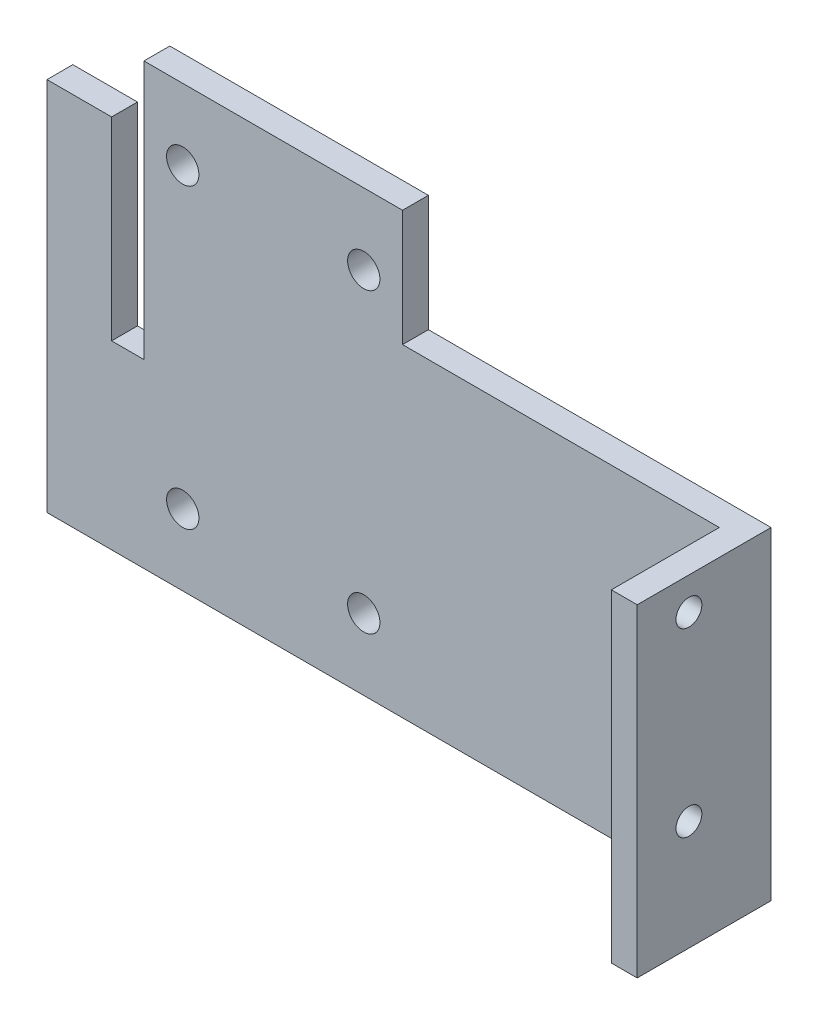
ISO-10303-21;
HEADER;
FILE_DESCRIPTION(('STEP AP214'),'2;1');
FILE_NAME('part.step','',(''),(''),'','','');
FILE_SCHEMA(('AUTOMOTIVE_DESIGN { 1 0 10303 214 1 1 1 1 }'));
ENDSEC;
DATA;
#1=APPLICATION_CONTEXT('core data for automotive mechanical design processes');
#2=APPLICATION_PROTOCOL_DEFINITION('international standard','automotive_design',2000,#1);
#3=PRODUCT_CONTEXT('',#1,'mechanical');
#4=PRODUCT('Part','Part','',(#3));
#5=PRODUCT_RELATED_PRODUCT_CATEGORY('part','',(#4));
#6=PRODUCT_DEFINITION_FORMATION('','',#4);
#7=PRODUCT_DEFINITION_CONTEXT('part definition',#1,'design');
#8=PRODUCT_DEFINITION('design','',#6,#7);
#9=PRODUCT_DEFINITION_SHAPE('','',#8);
#10=(LENGTH_UNIT() NAMED_UNIT(*) SI_UNIT(.MILLI.,.METRE.));
#11=(NAMED_UNIT(*) PLANE_ANGLE_UNIT() SI_UNIT($,.RADIAN.));
#12=(NAMED_UNIT(*) SI_UNIT($,.STERADIAN.) SOLID_ANGLE_UNIT());
#13=UNCERTAINTY_MEASURE_WITH_UNIT(LENGTH_MEASURE(1.E-05),#10,'distance_accuracy_value','');
#14=(GEOMETRIC_REPRESENTATION_CONTEXT(3) GLOBAL_UNCERTAINTY_ASSIGNED_CONTEXT((#13)) GLOBAL_UNIT_ASSIGNED_CONTEXT((#10,
#11,#12)) REPRESENTATION_CONTEXT('',''));
#15=CARTESIAN_POINT('',(0.,0.,0.));
#16=DIRECTION('',(0.,0.,1.));
#17=DIRECTION('',(1.,0.,0.));
#18=AXIS2_PLACEMENT_3D('',#15,#16,#17);
#19=CARTESIAN_POINT('',(0.,0.,4.));
#20=DIRECTION('',(0.,0.,-1.));
#21=DIRECTION('',(-1.,0.,0.));
#22=AXIS2_PLACEMENT_3D('',#19,#20,#21);
#23=PLANE('',#22);
#24=CARTESIAN_POINT('',(93.,25.,4.));
#25=DIRECTION('',(0.,0.,1.));
#26=DIRECTION('',(1.,0.,0.));
#27=AXIS2_PLACEMENT_3D('',#24,#25,#26);
#28=CIRCLE('',#27,2.5);
#29=CARTESIAN_POINT('',(95.5,25.,4.));
#30=VERTEX_POINT('',#29);
#31=EDGE_CURVE('E180',#30,#30,#28,.T.);
#32=ORIENTED_EDGE('',*,*,#31,.F.);
#33=EDGE_LOOP('',(#32));
#34=FACE_BOUND('',#33,.T.);
#35=CARTESIAN_POINT('',(49.,11.,4.));
#36=DIRECTION('',(0.,0.,1.));
#37=DIRECTION('',(1.,0.,0.));
#38=AXIS2_PLACEMENT_3D('',#35,#36,#37);
#39=CIRCLE('',#38,2.5);
#40=CARTESIAN_POINT('',(51.5,11.,4.));
#41=VERTEX_POINT('',#40);
#42=EDGE_CURVE('E188',#41,#41,#39,.T.);
#43=ORIENTED_EDGE('',*,*,#42,.F.);
#44=EDGE_LOOP('',(#43));
#45=FACE_BOUND('',#44,.T.);
#46=CARTESIAN_POINT('',(21.,11.,4.));
#47=DIRECTION('',(0.,0.,1.));
#48=DIRECTION('',(1.,0.,0.));
#49=AXIS2_PLACEMENT_3D('',#46,#47,#48);
#50=CIRCLE('',#49,2.5);
#51=CARTESIAN_POINT('',(23.5,11.,4.));
#52=VERTEX_POINT('',#51);
#53=EDGE_CURVE('E194',#52,#52,#50,.T.);
#54=ORIENTED_EDGE('',*,*,#53,.F.);
#55=EDGE_LOOP('',(#54));
#56=FACE_BOUND('',#55,.T.);
#57=CARTESIAN_POINT('',(49.,57.,4.));
#58=DIRECTION('',(0.,0.,1.));
#59=DIRECTION('',(1.,0.,0.));
#60=AXIS2_PLACEMENT_3D('',#57,#58,#59);
#61=CIRCLE('',#60,2.5);
#62=CARTESIAN_POINT('',(51.5,57.,4.));
#63=VERTEX_POINT('',#62);
#64=EDGE_CURVE('E200',#63,#63,#61,.T.);
#65=ORIENTED_EDGE('',*,*,#64,.F.);
#66=EDGE_LOOP('',(#65));
#67=FACE_BOUND('',#66,.T.);
#68=CARTESIAN_POINT('',(21.,57.,4.));
#69=DIRECTION('',(0.,0.,1.));
#70=DIRECTION('',(1.,0.,0.));
#71=AXIS2_PLACEMENT_3D('',#68,#69,#70);
#72=CIRCLE('',#71,2.5);
#73=CARTESIAN_POINT('',(23.5,57.,4.));
#74=VERTEX_POINT('',#73);
#75=EDGE_CURVE('E204',#74,#74,#72,.T.);
#76=ORIENTED_EDGE('',*,*,#75,.F.);
#77=EDGE_LOOP('',(#76));
#78=FACE_BOUND('',#77,.T.);
#79=DIRECTION('',(-1.,0.,0.));
#80=VECTOR('',#79,1.);
#81=CARTESIAN_POINT('',(0.,68.,4.));
#82=LINE('',#81,#80);
#83=CARTESIAN_POINT('',(55.,68.,4.));
#84=VERTEX_POINT('',#83);
#85=CARTESIAN_POINT('',(15.,68.,4.));
#86=VERTEX_POINT('',#85);
#87=EDGE_CURVE('E285',#84,#86,#82,.T.);
#88=ORIENTED_EDGE('',*,*,#87,.T.);
#89=DIRECTION('',(0.,1.,0.));
#90=VECTOR('',#89,1.);
#91=CARTESIAN_POINT('',(15.,68.,4.));
#92=LINE('',#91,#90);
#93=CARTESIAN_POINT('',(15.,28.,4.));
#94=VERTEX_POINT('',#93);
#95=EDGE_CURVE('E52',#94,#86,#92,.T.);
#96=ORIENTED_EDGE('',*,*,#95,.F.);
#97=DIRECTION('',(1.,0.,0.));
#98=VECTOR('',#97,1.);
#99=CARTESIAN_POINT('',(15.,28.,4.));
#100=LINE('',#99,#98);
#101=CARTESIAN_POINT('',(10.,28.,4.));
#102=VERTEX_POINT('',#101);
#103=EDGE_CURVE('E333',#102,#94,#100,.T.);
#104=ORIENTED_EDGE('',*,*,#103,.F.);
#105=DIRECTION('',(0.,-1.,0.));
#106=VECTOR('',#105,1.);
#107=CARTESIAN_POINT('',(10.,58.,4.));
#108=LINE('',#107,#106);
#109=CARTESIAN_POINT('',(10.,58.,4.));
#110=VERTEX_POINT('',#109);
#111=EDGE_CURVE('E143',#110,#102,#108,.T.);
#112=ORIENTED_EDGE('',*,*,#111,.F.);
#113=DIRECTION('',(1.,0.,0.));
#114=VECTOR('',#113,1.);
#115=CARTESIAN_POINT('',(0.,58.,4.));
#116=LINE('',#115,#114);
#117=CARTESIAN_POINT('',(0.,58.,4.));
#118=VERTEX_POINT('',#117);
#119=EDGE_CURVE('E129',#118,#110,#116,.T.);
#120=ORIENTED_EDGE('',*,*,#119,.F.);
#121=DIRECTION('',(0.,-1.,0.));
#122=VECTOR('',#121,1.);
#123=CARTESIAN_POINT('',(0.,0.,4.));
#124=LINE('',#123,#122);
#125=CARTESIAN_POINT('',(0.,0.,4.));
#126=VERTEX_POINT('',#125);
#127=EDGE_CURVE('E139',#118,#126,#124,.T.);
#128=ORIENTED_EDGE('',*,*,#127,.T.);
#129=DIRECTION('',(1.,0.,0.));
#130=VECTOR('',#129,1.);
#131=CARTESIAN_POINT('',(0.,0.,4.));
#132=LINE('',#131,#130);
#133=CARTESIAN_POINT('',(104.,0.,4.));
#134=VERTEX_POINT('',#133);
#135=EDGE_CURVE('E148',#126,#134,#132,.T.);
#136=ORIENTED_EDGE('',*,*,#135,.T.);
#137=DIRECTION('',(0.,-1.,0.));
#138=VECTOR('',#137,1.);
#139=CARTESIAN_POINT('',(104.,50.,4.));
#140=LINE('',#139,#138);
#141=CARTESIAN_POINT('',(104.,50.,4.));
#142=VERTEX_POINT('',#141);
#143=EDGE_CURVE('E60',#142,#134,#140,.T.);
#144=ORIENTED_EDGE('',*,*,#143,.F.);
#145=DIRECTION('',(-1.,0.,0.));
#146=VECTOR('',#145,1.);
#147=CARTESIAN_POINT('',(55.,50.,4.));
#148=LINE('',#147,#146);
#149=CARTESIAN_POINT('',(55.,50.,4.));
#150=VERTEX_POINT('',#149);
#151=EDGE_CURVE('E151',#142,#150,#148,.T.);
#152=ORIENTED_EDGE('',*,*,#151,.T.);
#153=DIRECTION('',(0.,1.,0.));
#154=VECTOR('',#153,1.);
#155=CARTESIAN_POINT('',(55.,68.,4.));
#156=LINE('',#155,#154);
#157=EDGE_CURVE('E168',#150,#84,#156,.T.);
#158=ORIENTED_EDGE('',*,*,#157,.T.);
#159=EDGE_LOOP('',(#88,#96,#104,#112,#120,#128,#136,#144,#152,#158));
#160=FACE_BOUND('',#159,.T.);
#161=ADVANCED_FACE('F37',(#34,#45,#56,#67,#78,#160),#23,.F.);
#162=CARTESIAN_POINT('',(0.,0.,0.));
#163=DIRECTION('',(0.,0.,-1.));
#164=DIRECTION('',(-1.,0.,0.));
#165=AXIS2_PLACEMENT_3D('',#162,#163,#164);
#166=PLANE('',#165);
#167=DIRECTION('',(0.,-1.,0.));
#168=VECTOR('',#167,1.);
#169=CARTESIAN_POINT('',(15.,0.,0.));
#170=LINE('',#169,#168);
#171=CARTESIAN_POINT('',(15.,68.,0.));
#172=VERTEX_POINT('',#171);
#173=CARTESIAN_POINT('',(15.,28.,0.));
#174=VERTEX_POINT('',#173);
#175=EDGE_CURVE('E324',#172,#174,#170,.T.);
#176=ORIENTED_EDGE('',*,*,#175,.F.);
#177=DIRECTION('',(-1.,0.,0.));
#178=VECTOR('',#177,1.);
#179=CARTESIAN_POINT('',(0.,68.,0.));
#180=LINE('',#179,#178);
#181=CARTESIAN_POINT('',(55.,68.,0.));
#182=VERTEX_POINT('',#181);
#183=EDGE_CURVE('E149',#182,#172,#180,.T.);
#184=ORIENTED_EDGE('',*,*,#183,.F.);
#185=DIRECTION('',(0.,1.,0.));
#186=VECTOR('',#185,1.);
#187=CARTESIAN_POINT('',(55.,68.,0.));
#188=LINE('',#187,#186);
#189=CARTESIAN_POINT('',(55.,50.,0.));
#190=VERTEX_POINT('',#189);
#191=EDGE_CURVE('E154',#190,#182,#188,.T.);
#192=ORIENTED_EDGE('',*,*,#191,.F.);
#193=DIRECTION('',(-1.,0.,0.));
#194=VECTOR('',#193,1.);
#195=CARTESIAN_POINT('',(55.,50.,0.));
#196=LINE('',#195,#194);
#197=CARTESIAN_POINT('',(108.,50.,0.));
#198=VERTEX_POINT('',#197);
#199=EDGE_CURVE('E276',#198,#190,#196,.T.);
#200=ORIENTED_EDGE('',*,*,#199,.F.);
#201=DIRECTION('',(0.,1.,0.));
#202=VECTOR('',#201,1.);
#203=CARTESIAN_POINT('',(108.,0.,0.));
#204=LINE('',#203,#202);
#205=CARTESIAN_POINT('',(108.,0.,0.));
#206=VERTEX_POINT('',#205);
#207=EDGE_CURVE('E265',#206,#198,#204,.T.);
#208=ORIENTED_EDGE('',*,*,#207,.F.);
#209=DIRECTION('',(1.,0.,0.));
#210=VECTOR('',#209,1.);
#211=CARTESIAN_POINT('',(0.,0.,0.));
#212=LINE('',#211,#210);
#213=CARTESIAN_POINT('',(0.,0.,0.));
#214=VERTEX_POINT('',#213);
#215=EDGE_CURVE('E209',#214,#206,#212,.T.);
#216=ORIENTED_EDGE('',*,*,#215,.F.);
#217=DIRECTION('',(0.,-1.,0.));
#218=VECTOR('',#217,1.);
#219=CARTESIAN_POINT('',(0.,0.,0.));
#220=LINE('',#219,#218);
#221=CARTESIAN_POINT('',(0.,58.,0.));
#222=VERTEX_POINT('',#221);
#223=EDGE_CURVE('E206',#222,#214,#220,.T.);
#224=ORIENTED_EDGE('',*,*,#223,.F.);
#225=DIRECTION('',(-1.,0.,0.));
#226=VECTOR('',#225,1.);
#227=CARTESIAN_POINT('',(0.,58.,0.));
#228=LINE('',#227,#226);
#229=CARTESIAN_POINT('',(10.,58.,0.));
#230=VERTEX_POINT('',#229);
#231=EDGE_CURVE('E132',#230,#222,#228,.T.);
#232=ORIENTED_EDGE('',*,*,#231,.F.);
#233=DIRECTION('',(0.,1.,0.));
#234=VECTOR('',#233,1.);
#235=CARTESIAN_POINT('',(10.,0.,0.));
#236=LINE('',#235,#234);
#237=CARTESIAN_POINT('',(10.,28.,0.));
#238=VERTEX_POINT('',#237);
#239=EDGE_CURVE('E45',#238,#230,#236,.T.);
#240=ORIENTED_EDGE('',*,*,#239,.F.);
#241=DIRECTION('',(-1.,0.,0.));
#242=VECTOR('',#241,1.);
#243=CARTESIAN_POINT('',(0.,28.,0.));
#244=LINE('',#243,#242);
#245=EDGE_CURVE('E11',#174,#238,#244,.T.);
#246=ORIENTED_EDGE('',*,*,#245,.F.);
#247=EDGE_LOOP('',(#176,#184,#192,#200,#208,#216,#224,#232,#240,#246));
#248=FACE_BOUND('',#247,.T.);
#249=CARTESIAN_POINT('',(49.,11.,0.));
#250=DIRECTION('',(0.,0.,1.));
#251=DIRECTION('',(1.,0.,0.));
#252=AXIS2_PLACEMENT_3D('',#249,#250,#251);
#253=CIRCLE('',#252,2.5);
#254=CARTESIAN_POINT('',(51.5,11.,0.));
#255=VERTEX_POINT('',#254);
#256=EDGE_CURVE('E183',#255,#255,#253,.T.);
#257=ORIENTED_EDGE('',*,*,#256,.T.);
#258=EDGE_LOOP('',(#257));
#259=FACE_BOUND('',#258,.T.);
#260=CARTESIAN_POINT('',(49.,57.,0.));
#261=DIRECTION('',(0.,0.,1.));
#262=DIRECTION('',(1.,0.,0.));
#263=AXIS2_PLACEMENT_3D('',#260,#261,#262);
#264=CIRCLE('',#263,2.5);
#265=CARTESIAN_POINT('',(51.5,57.,0.));
#266=VERTEX_POINT('',#265);
#267=EDGE_CURVE('E197',#266,#266,#264,.T.);
#268=ORIENTED_EDGE('',*,*,#267,.T.);
#269=EDGE_LOOP('',(#268));
#270=FACE_BOUND('',#269,.T.);
#271=CARTESIAN_POINT('',(21.,57.,0.));
#272=DIRECTION('',(0.,0.,1.));
#273=DIRECTION('',(1.,0.,0.));
#274=AXIS2_PLACEMENT_3D('',#271,#272,#273);
#275=CIRCLE('',#274,2.5);
#276=CARTESIAN_POINT('',(23.5,57.,0.));
#277=VERTEX_POINT('',#276);
#278=EDGE_CURVE('E158',#277,#277,#275,.T.);
#279=ORIENTED_EDGE('',*,*,#278,.T.);
#280=EDGE_LOOP('',(#279));
#281=FACE_BOUND('',#280,.T.);
#282=CARTESIAN_POINT('',(21.,11.,0.));
#283=DIRECTION('',(0.,0.,1.));
#284=DIRECTION('',(1.,0.,0.));
#285=AXIS2_PLACEMENT_3D('',#282,#283,#284);
#286=CIRCLE('',#285,2.5);
#287=CARTESIAN_POINT('',(23.5,11.,0.));
#288=VERTEX_POINT('',#287);
#289=EDGE_CURVE('E191',#288,#288,#286,.T.);
#290=ORIENTED_EDGE('',*,*,#289,.T.);
#291=EDGE_LOOP('',(#290));
#292=FACE_BOUND('',#291,.T.);
#293=CARTESIAN_POINT('',(93.,25.,0.));
#294=DIRECTION('',(0.,0.,1.));
#295=DIRECTION('',(1.,0.,0.));
#296=AXIS2_PLACEMENT_3D('',#293,#294,#295);
#297=CIRCLE('',#296,2.5);
#298=CARTESIAN_POINT('',(95.5,25.,0.));
#299=VERTEX_POINT('',#298);
#300=EDGE_CURVE('E184',#299,#299,#297,.T.);
#301=ORIENTED_EDGE('',*,*,#300,.T.);
#302=EDGE_LOOP('',(#301));
#303=FACE_BOUND('',#302,.T.);
#304=ADVANCED_FACE('F214',(#248,#259,#270,#281,#292,#303),#166,.T.);
#305=CARTESIAN_POINT('',(0.,0.,4.));
#306=DIRECTION('',(1.,0.,0.));
#307=DIRECTION('',(0.,0.,-1.));
#308=AXIS2_PLACEMENT_3D('',#305,#306,#307);
#309=PLANE('',#308);
#310=ORIENTED_EDGE('',*,*,#127,.F.);
#311=DIRECTION('',(0.,0.,1.));
#312=VECTOR('',#311,1.);
#313=CARTESIAN_POINT('',(0.,58.,-6.));
#314=LINE('',#313,#312);
#315=EDGE_CURVE('E125',#222,#118,#314,.T.);
#316=ORIENTED_EDGE('',*,*,#315,.F.);
#317=ORIENTED_EDGE('',*,*,#223,.T.);
#318=DIRECTION('',(0.,0.,-1.));
#319=VECTOR('',#318,1.);
#320=CARTESIAN_POINT('',(0.,0.,4.));
#321=LINE('',#320,#319);
#322=EDGE_CURVE('E147',#126,#214,#321,.T.);
#323=ORIENTED_EDGE('',*,*,#322,.F.);
#324=EDGE_LOOP('',(#310,#316,#317,#323));
#325=FACE_BOUND('',#324,.T.);
#326=ADVANCED_FACE('F39',(#325),#309,.F.);
#327=CARTESIAN_POINT('',(0.,0.,4.));
#328=DIRECTION('',(0.,1.,0.));
#329=DIRECTION('',(0.,0.,1.));
#330=AXIS2_PLACEMENT_3D('',#327,#328,#329);
#331=PLANE('',#330);
#332=ORIENTED_EDGE('',*,*,#215,.T.);
#333=DIRECTION('',(0.,0.,-1.));
#334=VECTOR('',#333,1.);
#335=CARTESIAN_POINT('',(108.,0.,4.));
#336=LINE('',#335,#334);
#337=CARTESIAN_POINT('',(108.,0.,20.7));
#338=VERTEX_POINT('',#337);
#339=EDGE_CURVE('E262',#338,#206,#336,.T.);
#340=ORIENTED_EDGE('',*,*,#339,.F.);
#341=DIRECTION('',(1.,0.,0.));
#342=VECTOR('',#341,1.);
#343=CARTESIAN_POINT('',(108.,0.,20.7));
#344=LINE('',#343,#342);
#345=CARTESIAN_POINT('',(104.,0.,20.7));
#346=VERTEX_POINT('',#345);
#347=EDGE_CURVE('E178',#346,#338,#344,.T.);
#348=ORIENTED_EDGE('',*,*,#347,.F.);
#349=DIRECTION('',(0.,0.,-1.));
#350=VECTOR('',#349,1.);
#351=CARTESIAN_POINT('',(104.,0.,20.7));
#352=LINE('',#351,#350);
#353=EDGE_CURVE('E173',#346,#134,#352,.T.);
#354=ORIENTED_EDGE('',*,*,#353,.T.);
#355=ORIENTED_EDGE('',*,*,#135,.F.);
#356=ORIENTED_EDGE('',*,*,#322,.T.);
#357=EDGE_LOOP('',(#332,#340,#348,#354,#355,#356));
#358=FACE_BOUND('',#357,.T.);
#359=ADVANCED_FACE('F252',(#358),#331,.F.);
#360=CARTESIAN_POINT('',(108.,0.,4.));
#361=DIRECTION('',(-1.,0.,0.));
#362=DIRECTION('',(0.,0.,1.));
#363=AXIS2_PLACEMENT_3D('',#360,#361,#362);
#364=PLANE('',#363);
#365=CARTESIAN_POINT('',(108.,17.,12.7));
#366=DIRECTION('',(1.,0.,0.));
#367=DIRECTION('',(0.,0.,-1.));
#368=AXIS2_PLACEMENT_3D('',#365,#366,#367);
#369=CIRCLE('',#368,2.);
#370=CARTESIAN_POINT('',(108.,17.,10.7));
#371=VERTEX_POINT('',#370);
#372=EDGE_CURVE('E315',#371,#371,#369,.T.);
#373=ORIENTED_EDGE('',*,*,#372,.F.);
#374=EDGE_LOOP('',(#373));
#375=FACE_BOUND('',#374,.T.);
#376=CARTESIAN_POINT('',(108.,45.,12.7));
#377=DIRECTION('',(1.,0.,0.));
#378=DIRECTION('',(0.,0.,-1.));
#379=AXIS2_PLACEMENT_3D('',#376,#377,#378);
#380=CIRCLE('',#379,2.);
#381=CARTESIAN_POINT('',(108.,45.,10.7));
#382=VERTEX_POINT('',#381);
#383=EDGE_CURVE('E300',#382,#382,#380,.T.);
#384=ORIENTED_EDGE('',*,*,#383,.F.);
#385=EDGE_LOOP('',(#384));
#386=FACE_BOUND('',#385,.T.);
#387=ORIENTED_EDGE('',*,*,#207,.T.);
#388=DIRECTION('',(0.,0.,-1.));
#389=VECTOR('',#388,1.);
#390=CARTESIAN_POINT('',(108.,50.,4.));
#391=LINE('',#390,#389);
#392=CARTESIAN_POINT('',(108.,50.,20.7));
#393=VERTEX_POINT('',#392);
#394=EDGE_CURVE('E271',#393,#198,#391,.T.);
#395=ORIENTED_EDGE('',*,*,#394,.F.);
#396=DIRECTION('',(0.,1.,0.));
#397=VECTOR('',#396,1.);
#398=CARTESIAN_POINT('',(108.,50.,20.7));
#399=LINE('',#398,#397);
#400=EDGE_CURVE('E171',#338,#393,#399,.T.);
#401=ORIENTED_EDGE('',*,*,#400,.F.);
#402=ORIENTED_EDGE('',*,*,#339,.T.);
#403=EDGE_LOOP('',(#387,#395,#401,#402));
#404=FACE_BOUND('',#403,.T.);
#405=ADVANCED_FACE('F249',(#375,#386,#404),#364,.F.);
#406=CARTESIAN_POINT('',(55.,50.,4.));
#407=DIRECTION('',(0.,-1.,0.));
#408=DIRECTION('',(0.,0.,-1.));
#409=AXIS2_PLACEMENT_3D('',#406,#407,#408);
#410=PLANE('',#409);
#411=ORIENTED_EDGE('',*,*,#199,.T.);
#412=DIRECTION('',(0.,0.,-1.));
#413=VECTOR('',#412,1.);
#414=CARTESIAN_POINT('',(55.,50.,4.));
#415=LINE('',#414,#413);
#416=EDGE_CURVE('E284',#150,#190,#415,.T.);
#417=ORIENTED_EDGE('',*,*,#416,.F.);
#418=ORIENTED_EDGE('',*,*,#151,.F.);
#419=DIRECTION('',(0.,0.,-1.));
#420=VECTOR('',#419,1.);
#421=CARTESIAN_POINT('',(104.,50.,20.7));
#422=LINE('',#421,#420);
#423=CARTESIAN_POINT('',(104.,50.,20.7));
#424=VERTEX_POINT('',#423);
#425=EDGE_CURVE('E187',#424,#142,#422,.T.);
#426=ORIENTED_EDGE('',*,*,#425,.F.);
#427=DIRECTION('',(-1.,0.,0.));
#428=VECTOR('',#427,1.);
#429=CARTESIAN_POINT('',(108.,50.,20.7));
#430=LINE('',#429,#428);
#431=EDGE_CURVE('E291',#393,#424,#430,.T.);
#432=ORIENTED_EDGE('',*,*,#431,.F.);
#433=ORIENTED_EDGE('',*,*,#394,.T.);
#434=EDGE_LOOP('',(#411,#417,#418,#426,#432,#433));
#435=FACE_BOUND('',#434,.T.);
#436=ADVANCED_FACE('F245',(#435),#410,.F.);
#437=CARTESIAN_POINT('',(55.,68.,4.));
#438=DIRECTION('',(-1.,0.,0.));
#439=DIRECTION('',(0.,-1.,0.));
#440=AXIS2_PLACEMENT_3D('',#437,#438,#439);
#441=PLANE('',#440);
#442=ORIENTED_EDGE('',*,*,#191,.T.);
#443=DIRECTION('',(0.,0.,-1.));
#444=VECTOR('',#443,1.);
#445=CARTESIAN_POINT('',(55.,68.,4.));
#446=LINE('',#445,#444);
#447=EDGE_CURVE('E281',#84,#182,#446,.T.);
#448=ORIENTED_EDGE('',*,*,#447,.F.);
#449=ORIENTED_EDGE('',*,*,#157,.F.);
#450=ORIENTED_EDGE('',*,*,#416,.T.);
#451=EDGE_LOOP('',(#442,#448,#449,#450));
#452=FACE_BOUND('',#451,.T.);
#453=ADVANCED_FACE('F229',(#452),#441,.F.);
#454=CARTESIAN_POINT('',(0.,68.,4.));
#455=DIRECTION('',(0.,-1.,0.));
#456=DIRECTION('',(0.,0.,-1.));
#457=AXIS2_PLACEMENT_3D('',#454,#455,#456);
#458=PLANE('',#457);
#459=ORIENTED_EDGE('',*,*,#183,.T.);
#460=DIRECTION('',(0.,0.,1.));
#461=VECTOR('',#460,1.);
#462=CARTESIAN_POINT('',(15.,68.,4.));
#463=LINE('',#462,#461);
#464=EDGE_CURVE('E316',#172,#86,#463,.T.);
#465=ORIENTED_EDGE('',*,*,#464,.T.);
#466=ORIENTED_EDGE('',*,*,#87,.F.);
#467=ORIENTED_EDGE('',*,*,#447,.T.);
#468=EDGE_LOOP('',(#459,#465,#466,#467));
#469=FACE_BOUND('',#468,.T.);
#470=ADVANCED_FACE('F220',(#469),#458,.F.);
#471=CARTESIAN_POINT('',(21.,57.,4.));
#472=DIRECTION('',(0.,0.,-1.));
#473=DIRECTION('',(-1.,0.,0.));
#474=AXIS2_PLACEMENT_3D('',#471,#472,#473);
#475=CYLINDRICAL_SURFACE('',#474,2.5);
#476=ORIENTED_EDGE('',*,*,#75,.T.);
#477=EDGE_LOOP('',(#476));
#478=FACE_BOUND('',#477,.T.);
#479=ORIENTED_EDGE('',*,*,#278,.F.);
#480=EDGE_LOOP('',(#479));
#481=FACE_BOUND('',#480,.T.);
#482=ADVANCED_FACE('F217',(#478,#481),#475,.F.);
#483=CARTESIAN_POINT('',(49.,57.,4.));
#484=DIRECTION('',(0.,0.,-1.));
#485=DIRECTION('',(-1.,0.,0.));
#486=AXIS2_PLACEMENT_3D('',#483,#484,#485);
#487=CYLINDRICAL_SURFACE('',#486,2.5);
#488=ORIENTED_EDGE('',*,*,#64,.T.);
#489=EDGE_LOOP('',(#488));
#490=FACE_BOUND('',#489,.T.);
#491=ORIENTED_EDGE('',*,*,#267,.F.);
#492=EDGE_LOOP('',(#491));
#493=FACE_BOUND('',#492,.T.);
#494=ADVANCED_FACE('F219',(#490,#493),#487,.F.);
#495=CARTESIAN_POINT('',(21.,11.,4.));
#496=DIRECTION('',(0.,0.,-1.));
#497=DIRECTION('',(-1.,0.,0.));
#498=AXIS2_PLACEMENT_3D('',#495,#496,#497);
#499=CYLINDRICAL_SURFACE('',#498,2.5);
#500=ORIENTED_EDGE('',*,*,#53,.T.);
#501=EDGE_LOOP('',(#500));
#502=FACE_BOUND('',#501,.T.);
#503=ORIENTED_EDGE('',*,*,#289,.F.);
#504=EDGE_LOOP('',(#503));
#505=FACE_BOUND('',#504,.T.);
#506=ADVANCED_FACE('F226',(#502,#505),#499,.F.);
#507=CARTESIAN_POINT('',(49.,11.,4.));
#508=DIRECTION('',(0.,0.,-1.));
#509=DIRECTION('',(-1.,0.,0.));
#510=AXIS2_PLACEMENT_3D('',#507,#508,#509);
#511=CYLINDRICAL_SURFACE('',#510,2.5);
#512=ORIENTED_EDGE('',*,*,#42,.T.);
#513=EDGE_LOOP('',(#512));
#514=FACE_BOUND('',#513,.T.);
#515=ORIENTED_EDGE('',*,*,#256,.F.);
#516=EDGE_LOOP('',(#515));
#517=FACE_BOUND('',#516,.T.);
#518=ADVANCED_FACE('F373',(#514,#517),#511,.F.);
#519=CARTESIAN_POINT('',(93.,25.,4.));
#520=DIRECTION('',(0.,0.,-1.));
#521=DIRECTION('',(-1.,0.,0.));
#522=AXIS2_PLACEMENT_3D('',#519,#520,#521);
#523=CYLINDRICAL_SURFACE('',#522,2.5);
#524=ORIENTED_EDGE('',*,*,#31,.T.);
#525=EDGE_LOOP('',(#524));
#526=FACE_BOUND('',#525,.T.);
#527=ORIENTED_EDGE('',*,*,#300,.F.);
#528=EDGE_LOOP('',(#527));
#529=FACE_BOUND('',#528,.T.);
#530=ADVANCED_FACE('F369',(#526,#529),#523,.F.);
#531=CARTESIAN_POINT('',(104.,50.,20.7));
#532=DIRECTION('',(1.,0.,0.));
#533=DIRECTION('',(0.,0.,-1.));
#534=AXIS2_PLACEMENT_3D('',#531,#532,#533);
#535=PLANE('',#534);
#536=CARTESIAN_POINT('',(104.,17.,12.7));
#537=DIRECTION('',(1.,0.,0.));
#538=DIRECTION('',(0.,0.,-1.));
#539=AXIS2_PLACEMENT_3D('',#536,#537,#538);
#540=CIRCLE('',#539,2.);
#541=CARTESIAN_POINT('',(104.,17.,10.7));
#542=VERTEX_POINT('',#541);
#543=EDGE_CURVE('E312',#542,#542,#540,.T.);
#544=ORIENTED_EDGE('',*,*,#543,.T.);
#545=EDGE_LOOP('',(#544));
#546=FACE_BOUND('',#545,.T.);
#547=CARTESIAN_POINT('',(104.,45.,12.7));
#548=DIRECTION('',(1.,0.,0.));
#549=DIRECTION('',(0.,0.,-1.));
#550=AXIS2_PLACEMENT_3D('',#547,#548,#549);
#551=CIRCLE('',#550,2.);
#552=CARTESIAN_POINT('',(104.,45.,10.7));
#553=VERTEX_POINT('',#552);
#554=EDGE_CURVE('E172',#553,#553,#551,.T.);
#555=ORIENTED_EDGE('',*,*,#554,.T.);
#556=EDGE_LOOP('',(#555));
#557=FACE_BOUND('',#556,.T.);
#558=ORIENTED_EDGE('',*,*,#143,.T.);
#559=ORIENTED_EDGE('',*,*,#353,.F.);
#560=DIRECTION('',(0.,-1.,0.));
#561=VECTOR('',#560,1.);
#562=CARTESIAN_POINT('',(104.,50.,20.7));
#563=LINE('',#562,#561);
#564=EDGE_CURVE('E295',#424,#346,#563,.T.);
#565=ORIENTED_EDGE('',*,*,#564,.F.);
#566=ORIENTED_EDGE('',*,*,#425,.T.);
#567=EDGE_LOOP('',(#558,#559,#565,#566));
#568=FACE_BOUND('',#567,.T.);
#569=ADVANCED_FACE('F366',(#546,#557,#568),#535,.F.);
#570=CARTESIAN_POINT('',(0.,0.,20.7));
#571=DIRECTION('',(0.,0.,-1.));
#572=DIRECTION('',(-1.,0.,0.));
#573=AXIS2_PLACEMENT_3D('',#570,#571,#572);
#574=PLANE('',#573);
#575=ORIENTED_EDGE('',*,*,#400,.T.);
#576=ORIENTED_EDGE('',*,*,#431,.T.);
#577=ORIENTED_EDGE('',*,*,#564,.T.);
#578=ORIENTED_EDGE('',*,*,#347,.T.);
#579=EDGE_LOOP('',(#575,#576,#577,#578));
#580=FACE_BOUND('',#579,.T.);
#581=ADVANCED_FACE('F297',(#580),#574,.F.);
#582=CARTESIAN_POINT('',(98.,45.,12.7));
#583=DIRECTION('',(1.,0.,0.));
#584=DIRECTION('',(0.,0.,-1.));
#585=AXIS2_PLACEMENT_3D('',#582,#583,#584);
#586=CYLINDRICAL_SURFACE('',#585,2.);
#587=ORIENTED_EDGE('',*,*,#383,.T.);
#588=EDGE_LOOP('',(#587));
#589=FACE_BOUND('',#588,.T.);
#590=ORIENTED_EDGE('',*,*,#554,.F.);
#591=EDGE_LOOP('',(#590));
#592=FACE_BOUND('',#591,.T.);
#593=ADVANCED_FACE('F353',(#589,#592),#586,.F.);
#594=CARTESIAN_POINT('',(98.,17.,12.7));
#595=DIRECTION('',(1.,0.,0.));
#596=DIRECTION('',(0.,0.,-1.));
#597=AXIS2_PLACEMENT_3D('',#594,#595,#596);
#598=CYLINDRICAL_SURFACE('',#597,2.);
#599=ORIENTED_EDGE('',*,*,#372,.T.);
#600=EDGE_LOOP('',(#599));
#601=FACE_BOUND('',#600,.T.);
#602=ORIENTED_EDGE('',*,*,#543,.F.);
#603=EDGE_LOOP('',(#602));
#604=FACE_BOUND('',#603,.T.);
#605=ADVANCED_FACE('F346',(#601,#604),#598,.F.);
#606=CARTESIAN_POINT('',(15.,68.,-6.));
#607=DIRECTION('',(1.,0.,0.));
#608=DIRECTION('',(0.,1.,0.));
#609=AXIS2_PLACEMENT_3D('',#606,#607,#608);
#610=PLANE('',#609);
#611=ORIENTED_EDGE('',*,*,#175,.T.);
#612=DIRECTION('',(0.,0.,1.));
#613=VECTOR('',#612,1.);
#614=CARTESIAN_POINT('',(15.,28.,-6.));
#615=LINE('',#614,#613);
#616=EDGE_CURVE('E327',#174,#94,#615,.T.);
#617=ORIENTED_EDGE('',*,*,#616,.T.);
#618=ORIENTED_EDGE('',*,*,#95,.T.);
#619=ORIENTED_EDGE('',*,*,#464,.F.);
#620=EDGE_LOOP('',(#611,#617,#618,#619));
#621=FACE_BOUND('',#620,.T.);
#622=ADVANCED_FACE('F344',(#621),#610,.F.);
#623=CARTESIAN_POINT('',(15.,28.,-6.));
#624=DIRECTION('',(0.,-1.,0.));
#625=DIRECTION('',(0.,0.,-1.));
#626=AXIS2_PLACEMENT_3D('',#623,#624,#625);
#627=PLANE('',#626);
#628=ORIENTED_EDGE('',*,*,#245,.T.);
#629=DIRECTION('',(0.,0.,1.));
#630=VECTOR('',#629,1.);
#631=CARTESIAN_POINT('',(10.,28.,-6.));
#632=LINE('',#631,#630);
#633=EDGE_CURVE('E321',#238,#102,#632,.T.);
#634=ORIENTED_EDGE('',*,*,#633,.T.);
#635=ORIENTED_EDGE('',*,*,#103,.T.);
#636=ORIENTED_EDGE('',*,*,#616,.F.);
#637=EDGE_LOOP('',(#628,#634,#635,#636));
#638=FACE_BOUND('',#637,.T.);
#639=ADVANCED_FACE('F338',(#638),#627,.F.);
#640=CARTESIAN_POINT('',(10.,58.,-6.));
#641=DIRECTION('',(-1.,0.,0.));
#642=DIRECTION('',(0.,-1.,0.));
#643=AXIS2_PLACEMENT_3D('',#640,#641,#642);
#644=PLANE('',#643);
#645=ORIENTED_EDGE('',*,*,#239,.T.);
#646=DIRECTION('',(0.,0.,1.));
#647=VECTOR('',#646,1.);
#648=CARTESIAN_POINT('',(10.,58.,-6.));
#649=LINE('',#648,#647);
#650=EDGE_CURVE('E136',#230,#110,#649,.T.);
#651=ORIENTED_EDGE('',*,*,#650,.T.);
#652=ORIENTED_EDGE('',*,*,#111,.T.);
#653=ORIENTED_EDGE('',*,*,#633,.F.);
#654=EDGE_LOOP('',(#645,#651,#652,#653));
#655=FACE_BOUND('',#654,.T.);
#656=ADVANCED_FACE('F320',(#655),#644,.F.);
#657=CARTESIAN_POINT('',(0.,58.,-6.));
#658=DIRECTION('',(0.,-1.,0.));
#659=DIRECTION('',(0.,0.,-1.));
#660=AXIS2_PLACEMENT_3D('',#657,#658,#659);
#661=PLANE('',#660);
#662=ORIENTED_EDGE('',*,*,#231,.T.);
#663=ORIENTED_EDGE('',*,*,#315,.T.);
#664=ORIENTED_EDGE('',*,*,#119,.T.);
#665=ORIENTED_EDGE('',*,*,#650,.F.);
#666=EDGE_LOOP('',(#662,#663,#664,#665));
#667=FACE_BOUND('',#666,.T.);
#668=ADVANCED_FACE('F127',(#667),#661,.F.);
#669=CLOSED_SHELL('',(#161,#304,#326,#359,#405,#436,#453,#470,#482,#494,#506,#518,#530,#569,
#581,#593,#605,#622,#639,#656,#668));
#670=MANIFOLD_SOLID_BREP('B2',#669);
#671=ADVANCED_BREP_SHAPE_REPRESENTATION('',(#18,#670),#14);
#672=SHAPE_DEFINITION_REPRESENTATION(#9,#671);
ENDSEC;
END-ISO-10303-21;
